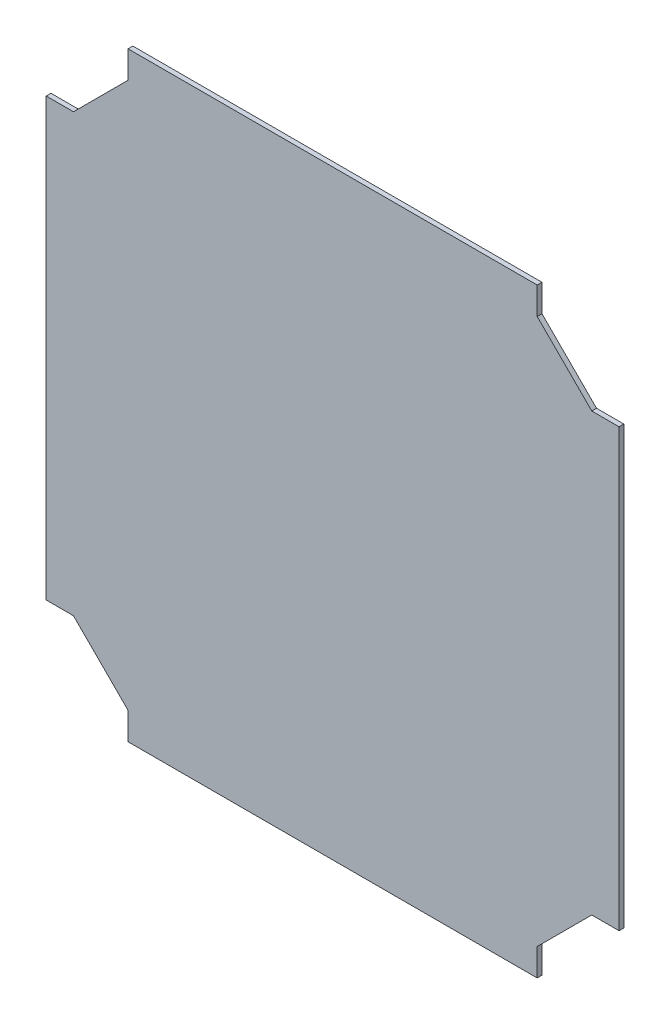
ISO-10303-21;
HEADER;
FILE_DESCRIPTION(('STEP AP214'),'2;1');
FILE_NAME('part.step','',(''),(''),'','','');
FILE_SCHEMA(('AUTOMOTIVE_DESIGN { 1 0 10303 214 1 1 1 1 }'));
ENDSEC;
DATA;
#1=APPLICATION_CONTEXT('core data for automotive mechanical design processes');
#2=APPLICATION_PROTOCOL_DEFINITION('international standard','automotive_design',2000,#1);
#3=PRODUCT_CONTEXT('',#1,'mechanical');
#4=PRODUCT('Part','Part','',(#3));
#5=PRODUCT_RELATED_PRODUCT_CATEGORY('part','',(#4));
#6=PRODUCT_DEFINITION_FORMATION('','',#4);
#7=PRODUCT_DEFINITION_CONTEXT('part definition',#1,'design');
#8=PRODUCT_DEFINITION('design','',#6,#7);
#9=PRODUCT_DEFINITION_SHAPE('','',#8);
#10=(LENGTH_UNIT() NAMED_UNIT(*) SI_UNIT(.MILLI.,.METRE.));
#11=(NAMED_UNIT(*) PLANE_ANGLE_UNIT() SI_UNIT($,.RADIAN.));
#12=(NAMED_UNIT(*) SI_UNIT($,.STERADIAN.) SOLID_ANGLE_UNIT());
#13=UNCERTAINTY_MEASURE_WITH_UNIT(LENGTH_MEASURE(1.E-05),#10,'distance_accuracy_value','');
#14=(GEOMETRIC_REPRESENTATION_CONTEXT(3) GLOBAL_UNCERTAINTY_ASSIGNED_CONTEXT((#13)) GLOBAL_UNIT_ASSIGNED_CONTEXT((#10,
#11,#12)) REPRESENTATION_CONTEXT('',''));
#15=CARTESIAN_POINT('',(0.,0.,0.));
#16=DIRECTION('',(0.,0.,1.));
#17=DIRECTION('',(1.,0.,0.));
#18=AXIS2_PLACEMENT_3D('',#15,#16,#17);
#19=CARTESIAN_POINT('',(-74.4468485132246,419.999999999776,3.5));
#20=DIRECTION('',(1.,1.5404344466475E-13,0.));
#21=DIRECTION('',(-1.5404344466475E-13,1.,0.));
#22=AXIS2_PLACEMENT_3D('',#19,#20,#21);
#23=PLANE('',#22);
#24=DIRECTION('',(1.5404344466475E-13,-1.,0.));
#25=VECTOR('',#24,1.);
#26=CARTESIAN_POINT('',(-74.4468485132246,419.999999999776,0.));
#27=LINE('',#26,#25);
#28=CARTESIAN_POINT('',(-74.4468485132277,440.000000000034,0.));
#29=VERTEX_POINT('',#28);
#30=CARTESIAN_POINT('',(-74.4468485132246,419.999999999776,0.));
#31=VERTEX_POINT('',#30);
#32=EDGE_CURVE('E183',#29,#31,#27,.T.);
#33=ORIENTED_EDGE('',*,*,#32,.T.);
#34=DIRECTION('',(0.,0.,-1.));
#35=VECTOR('',#34,1.);
#36=CARTESIAN_POINT('',(-74.4468485132246,419.999999999776,3.5));
#37=LINE('',#36,#35);
#38=CARTESIAN_POINT('',(-74.4468485132246,419.999999999776,3.5));
#39=VERTEX_POINT('',#38);
#40=EDGE_CURVE('E11',#39,#31,#37,.T.);
#41=ORIENTED_EDGE('',*,*,#40,.F.);
#42=DIRECTION('',(1.5404344466475E-13,-1.,0.));
#43=VECTOR('',#42,1.);
#44=CARTESIAN_POINT('',(-74.4468485132246,419.999999999776,3.5));
#45=LINE('',#44,#43);
#46=CARTESIAN_POINT('',(-74.4468485132277,440.000000000034,3.5));
#47=VERTEX_POINT('',#46);
#48=EDGE_CURVE('E214',#47,#39,#45,.T.);
#49=ORIENTED_EDGE('',*,*,#48,.F.);
#50=DIRECTION('',(0.,0.,-1.));
#51=VECTOR('',#50,1.);
#52=CARTESIAN_POINT('',(-74.4468485132277,440.000000000034,3.5));
#53=LINE('',#52,#51);
#54=EDGE_CURVE('E179',#47,#29,#53,.T.);
#55=ORIENTED_EDGE('',*,*,#54,.T.);
#56=EDGE_LOOP('',(#33,#41,#49,#55));
#57=FACE_BOUND('',#56,.T.);
#58=ADVANCED_FACE('F39',(#57),#23,.F.);
#59=CARTESIAN_POINT('',(-114.446848512919,380.000000000058,3.5));
#60=DIRECTION('',(0.707106781186745,-0.70710678118635,0.));
#61=DIRECTION('',(0.70710678118635,0.707106781186745,0.));
#62=AXIS2_PLACEMENT_3D('',#59,#60,#61);
#63=PLANE('',#62);
#64=DIRECTION('',(-0.70710678118635,-0.707106781186745,0.));
#65=VECTOR('',#64,1.);
#66=CARTESIAN_POINT('',(-114.446848512919,380.000000000058,0.));
#67=LINE('',#66,#65);
#68=CARTESIAN_POINT('',(-114.446848512919,380.000000000058,0.));
#69=VERTEX_POINT('',#68);
#70=EDGE_CURVE('E186',#31,#69,#67,.T.);
#71=ORIENTED_EDGE('',*,*,#70,.T.);
#72=DIRECTION('',(0.,0.,-1.));
#73=VECTOR('',#72,1.);
#74=CARTESIAN_POINT('',(-114.446848512919,380.000000000058,3.5));
#75=LINE('',#74,#73);
#76=CARTESIAN_POINT('',(-114.446848512919,380.000000000058,3.5));
#77=VERTEX_POINT('',#76);
#78=EDGE_CURVE('E47',#77,#69,#75,.T.);
#79=ORIENTED_EDGE('',*,*,#78,.F.);
#80=DIRECTION('',(-0.70710678118635,-0.707106781186745,0.));
#81=VECTOR('',#80,1.);
#82=CARTESIAN_POINT('',(-114.446848512919,380.000000000058,3.5));
#83=LINE('',#82,#81);
#84=EDGE_CURVE('E122',#39,#77,#83,.T.);
#85=ORIENTED_EDGE('',*,*,#84,.F.);
#86=ORIENTED_EDGE('',*,*,#40,.T.);
#87=EDGE_LOOP('',(#71,#79,#85,#86));
#88=FACE_BOUND('',#87,.T.);
#89=ADVANCED_FACE('F312',(#88),#63,.F.);
#90=CARTESIAN_POINT('',(-134.446848512876,380.000000000059,3.5));
#91=DIRECTION('',(0.,-1.,0.));
#92=DIRECTION('',(1.,0.,0.));
#93=AXIS2_PLACEMENT_3D('',#90,#91,#92);
#94=PLANE('',#93);
#95=DIRECTION('',(-1.,0.,0.));
#96=VECTOR('',#95,1.);
#97=CARTESIAN_POINT('',(-134.446848512876,380.000000000059,0.));
#98=LINE('',#97,#96);
#99=CARTESIAN_POINT('',(-134.446848512876,380.000000000059,0.));
#100=VERTEX_POINT('',#99);
#101=EDGE_CURVE('E188',#69,#100,#98,.T.);
#102=ORIENTED_EDGE('',*,*,#101,.T.);
#103=DIRECTION('',(0.,0.,-1.));
#104=VECTOR('',#103,1.);
#105=CARTESIAN_POINT('',(-134.446848512876,380.000000000059,3.5));
#106=LINE('',#105,#104);
#107=CARTESIAN_POINT('',(-134.446848512876,380.000000000059,3.5));
#108=VERTEX_POINT('',#107);
#109=EDGE_CURVE('E245',#108,#100,#106,.T.);
#110=ORIENTED_EDGE('',*,*,#109,.F.);
#111=DIRECTION('',(-1.,0.,0.));
#112=VECTOR('',#111,1.);
#113=CARTESIAN_POINT('',(-134.446848512876,380.000000000059,3.5));
#114=LINE('',#113,#112);
#115=EDGE_CURVE('E253',#77,#108,#114,.T.);
#116=ORIENTED_EDGE('',*,*,#115,.F.);
#117=ORIENTED_EDGE('',*,*,#78,.T.);
#118=EDGE_LOOP('',(#102,#110,#116,#117));
#119=FACE_BOUND('',#118,.T.);
#120=ADVANCED_FACE('F251',(#119),#94,.F.);
#121=CARTESIAN_POINT('',(-134.446848512876,60.0000000000639,3.5));
#122=DIRECTION('',(1.,0.,0.));
#123=DIRECTION('',(0.,1.,0.));
#124=AXIS2_PLACEMENT_3D('',#121,#122,#123);
#125=PLANE('',#124);
#126=DIRECTION('',(0.,-1.,0.));
#127=VECTOR('',#126,1.);
#128=CARTESIAN_POINT('',(-134.446848512876,60.0000000000639,0.));
#129=LINE('',#128,#127);
#130=CARTESIAN_POINT('',(-134.446848512876,60.0000000000639,0.));
#131=VERTEX_POINT('',#130);
#132=EDGE_CURVE('E190',#100,#131,#129,.T.);
#133=ORIENTED_EDGE('',*,*,#132,.T.);
#134=DIRECTION('',(0.,0.,-1.));
#135=VECTOR('',#134,1.);
#136=CARTESIAN_POINT('',(-134.446848512876,60.0000000000639,3.5));
#137=LINE('',#136,#135);
#138=CARTESIAN_POINT('',(-134.446848512876,60.0000000000639,3.5));
#139=VERTEX_POINT('',#138);
#140=EDGE_CURVE('E242',#139,#131,#137,.T.);
#141=ORIENTED_EDGE('',*,*,#140,.F.);
#142=DIRECTION('',(0.,-1.,0.));
#143=VECTOR('',#142,1.);
#144=CARTESIAN_POINT('',(-134.446848512876,60.0000000000639,3.5));
#145=LINE('',#144,#143);
#146=EDGE_CURVE('E271',#108,#139,#145,.T.);
#147=ORIENTED_EDGE('',*,*,#146,.F.);
#148=ORIENTED_EDGE('',*,*,#109,.T.);
#149=EDGE_LOOP('',(#133,#141,#147,#148));
#150=FACE_BOUND('',#149,.T.);
#151=ADVANCED_FACE('F262',(#150),#125,.F.);
#152=CARTESIAN_POINT('',(-114.446848512873,60.0000000000639,3.5));
#153=DIRECTION('',(0.,1.,0.));
#154=DIRECTION('',(0.,0.,1.));
#155=AXIS2_PLACEMENT_3D('',#152,#153,#154);
#156=PLANE('',#155);
#157=DIRECTION('',(1.,0.,0.));
#158=VECTOR('',#157,1.);
#159=CARTESIAN_POINT('',(-114.446848512873,60.0000000000639,0.));
#160=LINE('',#159,#158);
#161=CARTESIAN_POINT('',(-114.446848512873,60.0000000000639,0.));
#162=VERTEX_POINT('',#161);
#163=EDGE_CURVE('E192',#131,#162,#160,.T.);
#164=ORIENTED_EDGE('',*,*,#163,.T.);
#165=DIRECTION('',(0.,0.,-1.));
#166=VECTOR('',#165,1.);
#167=CARTESIAN_POINT('',(-114.446848512873,60.0000000000639,3.5));
#168=LINE('',#167,#166);
#169=CARTESIAN_POINT('',(-114.446848512873,60.0000000000639,3.5));
#170=VERTEX_POINT('',#169);
#171=EDGE_CURVE('E239',#170,#162,#168,.T.);
#172=ORIENTED_EDGE('',*,*,#171,.F.);
#173=DIRECTION('',(1.,0.,0.));
#174=VECTOR('',#173,1.);
#175=CARTESIAN_POINT('',(-114.446848512873,60.0000000000639,3.5));
#176=LINE('',#175,#174);
#177=EDGE_CURVE('E268',#139,#170,#176,.T.);
#178=ORIENTED_EDGE('',*,*,#177,.F.);
#179=ORIENTED_EDGE('',*,*,#140,.T.);
#180=EDGE_LOOP('',(#164,#172,#178,#179));
#181=FACE_BOUND('',#180,.T.);
#182=ADVANCED_FACE('F266',(#181),#156,.F.);
#183=CARTESIAN_POINT('',(-74.4468485128761,20.0000000000889,3.5));
#184=DIRECTION('',(0.70710678118635,0.707106781186745,0.));
#185=DIRECTION('',(-0.707106781186745,0.70710678118635,0.));
#186=AXIS2_PLACEMENT_3D('',#183,#184,#185);
#187=PLANE('',#186);
#188=DIRECTION('',(0.707106781186745,-0.70710678118635,0.));
#189=VECTOR('',#188,1.);
#190=CARTESIAN_POINT('',(-74.4468485128761,20.0000000000889,0.));
#191=LINE('',#190,#189);
#192=CARTESIAN_POINT('',(-74.4468485128761,20.0000000000889,0.));
#193=VERTEX_POINT('',#192);
#194=EDGE_CURVE('E194',#162,#193,#191,.T.);
#195=ORIENTED_EDGE('',*,*,#194,.T.);
#196=DIRECTION('',(0.,0.,-1.));
#197=VECTOR('',#196,1.);
#198=CARTESIAN_POINT('',(-74.4468485128761,20.0000000000889,3.5));
#199=LINE('',#198,#197);
#200=CARTESIAN_POINT('',(-74.4468485128761,20.0000000000889,3.5));
#201=VERTEX_POINT('',#200);
#202=EDGE_CURVE('E236',#201,#193,#199,.T.);
#203=ORIENTED_EDGE('',*,*,#202,.F.);
#204=DIRECTION('',(0.707106781186745,-0.70710678118635,0.));
#205=VECTOR('',#204,1.);
#206=CARTESIAN_POINT('',(-74.4468485128761,20.0000000000889,3.5));
#207=LINE('',#206,#205);
#208=EDGE_CURVE('E270',#170,#201,#207,.T.);
#209=ORIENTED_EDGE('',*,*,#208,.F.);
#210=ORIENTED_EDGE('',*,*,#171,.T.);
#211=EDGE_LOOP('',(#195,#203,#209,#210));
#212=FACE_BOUND('',#211,.T.);
#213=ADVANCED_FACE('F325',(#212),#187,.F.);
#214=CARTESIAN_POINT('',(-74.4468485128761,-4.73422112382014E-12,3.5));
#215=DIRECTION('',(1.,0.,0.));
#216=DIRECTION('',(0.,0.,-1.));
#217=AXIS2_PLACEMENT_3D('',#214,#215,#216);
#218=PLANE('',#217);
#219=DIRECTION('',(0.,-1.,0.));
#220=VECTOR('',#219,1.);
#221=CARTESIAN_POINT('',(-74.4468485128761,-4.73422112382014E-12,0.));
#222=LINE('',#221,#220);
#223=CARTESIAN_POINT('',(-74.4468485128761,-4.73422112382014E-12,0.));
#224=VERTEX_POINT('',#223);
#225=EDGE_CURVE('E196',#193,#224,#222,.T.);
#226=ORIENTED_EDGE('',*,*,#225,.T.);
#227=DIRECTION('',(0.,0.,-1.));
#228=VECTOR('',#227,1.);
#229=CARTESIAN_POINT('',(-74.4468485128761,-4.73422112382014E-12,3.5));
#230=LINE('',#229,#228);
#231=CARTESIAN_POINT('',(-74.4468485128761,-4.73422112382014E-12,3.5));
#232=VERTEX_POINT('',#231);
#233=EDGE_CURVE('E233',#232,#224,#230,.T.);
#234=ORIENTED_EDGE('',*,*,#233,.F.);
#235=DIRECTION('',(0.,-1.,0.));
#236=VECTOR('',#235,1.);
#237=CARTESIAN_POINT('',(-74.4468485128761,-4.73422112382014E-12,3.5));
#238=LINE('',#237,#236);
#239=EDGE_CURVE('E273',#201,#232,#238,.T.);
#240=ORIENTED_EDGE('',*,*,#239,.F.);
#241=ORIENTED_EDGE('',*,*,#202,.T.);
#242=EDGE_LOOP('',(#226,#234,#240,#241));
#243=FACE_BOUND('',#242,.T.);
#244=ADVANCED_FACE('F328',(#243),#218,.F.);
#245=CARTESIAN_POINT('',(0.,0.,3.5));
#246=DIRECTION('',(0.,1.,0.));
#247=DIRECTION('',(-1.,0.,0.));
#248=AXIS2_PLACEMENT_3D('',#245,#246,#247);
#249=PLANE('',#248);
#250=DIRECTION('',(1.,0.,0.));
#251=VECTOR('',#250,1.);
#252=CARTESIAN_POINT('',(0.,0.,0.));
#253=LINE('',#252,#251);
#254=CARTESIAN_POINT('',(225.553151487123,-4.69748171984573E-12,0.));
#255=VERTEX_POINT('',#254);
#256=EDGE_CURVE('E199',#224,#255,#253,.T.);
#257=ORIENTED_EDGE('',*,*,#256,.T.);
#258=DIRECTION('',(0.,0.,-1.));
#259=VECTOR('',#258,1.);
#260=CARTESIAN_POINT('',(225.553151487123,-4.69748171984573E-12,3.5));
#261=LINE('',#260,#259);
#262=CARTESIAN_POINT('',(225.553151487123,-4.69748171984573E-12,3.5));
#263=VERTEX_POINT('',#262);
#264=EDGE_CURVE('E230',#263,#255,#261,.T.);
#265=ORIENTED_EDGE('',*,*,#264,.F.);
#266=DIRECTION('',(1.,0.,0.));
#267=VECTOR('',#266,1.);
#268=CARTESIAN_POINT('',(-74.4468485128761,-4.73422112382014E-12,3.5));
#269=LINE('',#268,#267);
#270=EDGE_CURVE('E279',#232,#263,#269,.T.);
#271=ORIENTED_EDGE('',*,*,#270,.F.);
#272=ORIENTED_EDGE('',*,*,#233,.T.);
#273=EDGE_LOOP('',(#257,#265,#271,#272));
#274=FACE_BOUND('',#273,.T.);
#275=ADVANCED_FACE('F332',(#274),#249,.F.);
#276=CARTESIAN_POINT('',(225.553151487123,20.000000000064,3.5));
#277=DIRECTION('',(-1.,0.,0.));
#278=DIRECTION('',(0.,0.,1.));
#279=AXIS2_PLACEMENT_3D('',#276,#277,#278);
#280=PLANE('',#279);
#281=DIRECTION('',(0.,1.,0.));
#282=VECTOR('',#281,1.);
#283=CARTESIAN_POINT('',(225.553151487123,20.000000000064,0.));
#284=LINE('',#283,#282);
#285=CARTESIAN_POINT('',(225.553151487123,20.000000000064,0.));
#286=VERTEX_POINT('',#285);
#287=EDGE_CURVE('E201',#255,#286,#284,.T.);
#288=ORIENTED_EDGE('',*,*,#287,.T.);
#289=DIRECTION('',(0.,0.,-1.));
#290=VECTOR('',#289,1.);
#291=CARTESIAN_POINT('',(225.553151487123,20.000000000064,3.5));
#292=LINE('',#291,#290);
#293=CARTESIAN_POINT('',(225.553151487123,20.000000000064,3.5));
#294=VERTEX_POINT('',#293);
#295=EDGE_CURVE('E227',#294,#286,#292,.T.);
#296=ORIENTED_EDGE('',*,*,#295,.F.);
#297=DIRECTION('',(0.,1.,0.));
#298=VECTOR('',#297,1.);
#299=CARTESIAN_POINT('',(225.553151487123,20.000000000064,3.5));
#300=LINE('',#299,#298);
#301=EDGE_CURVE('E281',#263,#294,#300,.T.);
#302=ORIENTED_EDGE('',*,*,#301,.F.);
#303=ORIENTED_EDGE('',*,*,#264,.T.);
#304=EDGE_LOOP('',(#288,#296,#302,#303));
#305=FACE_BOUND('',#304,.T.);
#306=ADVANCED_FACE('F336',(#305),#280,.F.);
#307=CARTESIAN_POINT('',(265.553151487073,60.0000000000393,3.5));
#308=DIRECTION('',(-0.707106781186773,0.707106781186322,0.));
#309=DIRECTION('',(-0.707106781186322,-0.707106781186773,0.));
#310=AXIS2_PLACEMENT_3D('',#307,#308,#309);
#311=PLANE('',#310);
#312=DIRECTION('',(0.707106781186322,0.707106781186773,0.));
#313=VECTOR('',#312,1.);
#314=CARTESIAN_POINT('',(265.553151487073,60.0000000000393,0.));
#315=LINE('',#314,#313);
#316=CARTESIAN_POINT('',(265.553151487073,60.0000000000393,0.));
#317=VERTEX_POINT('',#316);
#318=EDGE_CURVE('E203',#286,#317,#315,.T.);
#319=ORIENTED_EDGE('',*,*,#318,.T.);
#320=DIRECTION('',(0.,0.,-1.));
#321=VECTOR('',#320,1.);
#322=CARTESIAN_POINT('',(265.553151487073,60.0000000000393,3.5));
#323=LINE('',#322,#321);
#324=CARTESIAN_POINT('',(265.553151487073,60.0000000000393,3.5));
#325=VERTEX_POINT('',#324);
#326=EDGE_CURVE('E224',#325,#317,#323,.T.);
#327=ORIENTED_EDGE('',*,*,#326,.F.);
#328=DIRECTION('',(0.707106781186322,0.707106781186773,0.));
#329=VECTOR('',#328,1.);
#330=CARTESIAN_POINT('',(265.553151487073,60.0000000000393,3.5));
#331=LINE('',#330,#329);
#332=EDGE_CURVE('E283',#294,#325,#331,.T.);
#333=ORIENTED_EDGE('',*,*,#332,.F.);
#334=ORIENTED_EDGE('',*,*,#295,.T.);
#335=EDGE_LOOP('',(#319,#327,#333,#334));
#336=FACE_BOUND('',#335,.T.);
#337=ADVANCED_FACE('F340',(#336),#311,.F.);
#338=CARTESIAN_POINT('',(285.553151487212,60.000000000039,3.5));
#339=DIRECTION('',(0.,1.,0.));
#340=DIRECTION('',(-1.,0.,0.));
#341=AXIS2_PLACEMENT_3D('',#338,#339,#340);
#342=PLANE('',#341);
#343=DIRECTION('',(1.,0.,0.));
#344=VECTOR('',#343,1.);
#345=CARTESIAN_POINT('',(285.553151487212,60.000000000039,0.));
#346=LINE('',#345,#344);
#347=CARTESIAN_POINT('',(285.553151487212,60.000000000039,0.));
#348=VERTEX_POINT('',#347);
#349=EDGE_CURVE('E205',#317,#348,#346,.T.);
#350=ORIENTED_EDGE('',*,*,#349,.T.);
#351=DIRECTION('',(0.,0.,-1.));
#352=VECTOR('',#351,1.);
#353=CARTESIAN_POINT('',(285.553151487212,60.000000000039,3.5));
#354=LINE('',#353,#352);
#355=CARTESIAN_POINT('',(285.553151487212,60.000000000039,3.5));
#356=VERTEX_POINT('',#355);
#357=EDGE_CURVE('E221',#356,#348,#354,.T.);
#358=ORIENTED_EDGE('',*,*,#357,.F.);
#359=DIRECTION('',(1.,0.,0.));
#360=VECTOR('',#359,1.);
#361=CARTESIAN_POINT('',(285.553151487212,60.000000000039,3.5));
#362=LINE('',#361,#360);
#363=EDGE_CURVE('E285',#325,#356,#362,.T.);
#364=ORIENTED_EDGE('',*,*,#363,.F.);
#365=ORIENTED_EDGE('',*,*,#326,.T.);
#366=EDGE_LOOP('',(#350,#358,#364,#365));
#367=FACE_BOUND('',#366,.T.);
#368=ADVANCED_FACE('F344',(#367),#342,.F.);
#369=CARTESIAN_POINT('',(285.553151487212,380.000000000038,3.5));
#370=DIRECTION('',(-1.,0.,0.));
#371=DIRECTION('',(0.,-1.,0.));
#372=AXIS2_PLACEMENT_3D('',#369,#370,#371);
#373=PLANE('',#372);
#374=DIRECTION('',(0.,1.,0.));
#375=VECTOR('',#374,1.);
#376=CARTESIAN_POINT('',(285.553151487212,380.000000000038,0.));
#377=LINE('',#376,#375);
#378=CARTESIAN_POINT('',(285.553151487212,380.000000000038,0.));
#379=VERTEX_POINT('',#378);
#380=EDGE_CURVE('E207',#348,#379,#377,.T.);
#381=ORIENTED_EDGE('',*,*,#380,.T.);
#382=DIRECTION('',(0.,0.,-1.));
#383=VECTOR('',#382,1.);
#384=CARTESIAN_POINT('',(285.553151487212,380.000000000038,3.5));
#385=LINE('',#384,#383);
#386=CARTESIAN_POINT('',(285.553151487212,380.000000000038,3.5));
#387=VERTEX_POINT('',#386);
#388=EDGE_CURVE('E218',#387,#379,#385,.T.);
#389=ORIENTED_EDGE('',*,*,#388,.F.);
#390=DIRECTION('',(0.,1.,0.));
#391=VECTOR('',#390,1.);
#392=CARTESIAN_POINT('',(285.553151487212,380.000000000038,3.5));
#393=LINE('',#392,#391);
#394=EDGE_CURVE('E287',#356,#387,#393,.T.);
#395=ORIENTED_EDGE('',*,*,#394,.F.);
#396=ORIENTED_EDGE('',*,*,#357,.T.);
#397=EDGE_LOOP('',(#381,#389,#395,#396));
#398=FACE_BOUND('',#397,.T.);
#399=ADVANCED_FACE('F293',(#398),#373,.F.);
#400=CARTESIAN_POINT('',(265.55315148725,380.000000000039,3.5));
#401=DIRECTION('',(0.,-1.,0.));
#402=DIRECTION('',(1.,0.,0.));
#403=AXIS2_PLACEMENT_3D('',#400,#401,#402);
#404=PLANE('',#403);
#405=DIRECTION('',(-1.,0.,0.));
#406=VECTOR('',#405,1.);
#407=CARTESIAN_POINT('',(265.55315148725,380.000000000039,0.));
#408=LINE('',#407,#406);
#409=CARTESIAN_POINT('',(265.55315148725,380.000000000039,0.));
#410=VERTEX_POINT('',#409);
#411=EDGE_CURVE('E209',#379,#410,#408,.T.);
#412=ORIENTED_EDGE('',*,*,#411,.T.);
#413=DIRECTION('',(0.,0.,-1.));
#414=VECTOR('',#413,1.);
#415=CARTESIAN_POINT('',(265.55315148725,380.000000000039,3.5));
#416=LINE('',#415,#414);
#417=CARTESIAN_POINT('',(265.55315148725,380.000000000039,3.5));
#418=VERTEX_POINT('',#417);
#419=EDGE_CURVE('E174',#418,#410,#416,.T.);
#420=ORIENTED_EDGE('',*,*,#419,.F.);
#421=DIRECTION('',(-1.,0.,0.));
#422=VECTOR('',#421,1.);
#423=CARTESIAN_POINT('',(265.55315148725,380.000000000039,3.5));
#424=LINE('',#423,#422);
#425=EDGE_CURVE('E165',#387,#418,#424,.T.);
#426=ORIENTED_EDGE('',*,*,#425,.F.);
#427=ORIENTED_EDGE('',*,*,#388,.T.);
#428=EDGE_LOOP('',(#412,#420,#426,#427));
#429=FACE_BOUND('',#428,.T.);
#430=ADVANCED_FACE('F297',(#429),#404,.F.);
#431=CARTESIAN_POINT('',(225.553151486093,420.000000001174,3.5));
#432=DIRECTION('',(-0.707106781186349,-0.707106781186746,0.));
#433=DIRECTION('',(0.707106781186746,-0.707106781186349,0.));
#434=AXIS2_PLACEMENT_3D('',#431,#432,#433);
#435=PLANE('',#434);
#436=DIRECTION('',(-0.707106781186746,0.707106781186349,0.));
#437=VECTOR('',#436,1.);
#438=CARTESIAN_POINT('',(225.553151486093,420.000000001174,0.));
#439=LINE('',#438,#437);
#440=CARTESIAN_POINT('',(225.553151486093,420.000000001174,0.));
#441=VERTEX_POINT('',#440);
#442=EDGE_CURVE('E173',#410,#441,#439,.T.);
#443=ORIENTED_EDGE('',*,*,#442,.T.);
#444=DIRECTION('',(0.,0.,-1.));
#445=VECTOR('',#444,1.);
#446=CARTESIAN_POINT('',(225.553151486093,420.000000001174,3.5));
#447=LINE('',#446,#445);
#448=CARTESIAN_POINT('',(225.553151486093,420.000000001174,3.5));
#449=VERTEX_POINT('',#448);
#450=EDGE_CURVE('E170',#449,#441,#447,.T.);
#451=ORIENTED_EDGE('',*,*,#450,.F.);
#452=DIRECTION('',(-0.707106781186746,0.707106781186349,0.));
#453=VECTOR('',#452,1.);
#454=CARTESIAN_POINT('',(225.553151486093,420.000000001174,3.5));
#455=LINE('',#454,#453);
#456=EDGE_CURVE('E159',#418,#449,#455,.T.);
#457=ORIENTED_EDGE('',*,*,#456,.F.);
#458=ORIENTED_EDGE('',*,*,#419,.T.);
#459=EDGE_LOOP('',(#443,#451,#457,#458));
#460=FACE_BOUND('',#459,.T.);
#461=ADVANCED_FACE('F171',(#460),#435,.F.);
#462=CARTESIAN_POINT('',(225.553151486093,440.000000000034,3.5));
#463=DIRECTION('',(-1.,0.,0.));
#464=DIRECTION('',(0.,-1.,0.));
#465=AXIS2_PLACEMENT_3D('',#462,#463,#464);
#466=PLANE('',#465);
#467=DIRECTION('',(0.,1.,0.));
#468=VECTOR('',#467,1.);
#469=CARTESIAN_POINT('',(225.553151486093,440.000000000034,0.));
#470=LINE('',#469,#468);
#471=CARTESIAN_POINT('',(225.553151486093,440.000000000034,0.));
#472=VERTEX_POINT('',#471);
#473=EDGE_CURVE('E108',#441,#472,#470,.T.);
#474=ORIENTED_EDGE('',*,*,#473,.T.);
#475=DIRECTION('',(0.,0.,-1.));
#476=VECTOR('',#475,1.);
#477=CARTESIAN_POINT('',(225.553151486093,440.000000000034,3.5));
#478=LINE('',#477,#476);
#479=CARTESIAN_POINT('',(225.553151486093,440.000000000034,3.5));
#480=VERTEX_POINT('',#479);
#481=EDGE_CURVE('E175',#480,#472,#478,.T.);
#482=ORIENTED_EDGE('',*,*,#481,.F.);
#483=DIRECTION('',(0.,1.,0.));
#484=VECTOR('',#483,1.);
#485=CARTESIAN_POINT('',(225.553151486093,440.000000000034,3.5));
#486=LINE('',#485,#484);
#487=EDGE_CURVE('E163',#449,#480,#486,.T.);
#488=ORIENTED_EDGE('',*,*,#487,.F.);
#489=ORIENTED_EDGE('',*,*,#450,.T.);
#490=EDGE_LOOP('',(#474,#482,#488,#489));
#491=FACE_BOUND('',#490,.T.);
#492=ADVANCED_FACE('F177',(#491),#466,.F.);
#493=CARTESIAN_POINT('',(-74.4468485132277,440.000000000034,3.5));
#494=DIRECTION('',(0.,-1.,0.));
#495=DIRECTION('',(0.,0.,-1.));
#496=AXIS2_PLACEMENT_3D('',#493,#494,#495);
#497=PLANE('',#496);
#498=DIRECTION('',(-1.,0.,0.));
#499=VECTOR('',#498,1.);
#500=CARTESIAN_POINT('',(-74.4468485132277,440.000000000034,0.));
#501=LINE('',#500,#499);
#502=EDGE_CURVE('E114',#472,#29,#501,.T.);
#503=ORIENTED_EDGE('',*,*,#502,.T.);
#504=ORIENTED_EDGE('',*,*,#54,.F.);
#505=DIRECTION('',(-1.,0.,0.));
#506=VECTOR('',#505,1.);
#507=CARTESIAN_POINT('',(-74.4468485132277,440.000000000034,3.5));
#508=LINE('',#507,#506);
#509=EDGE_CURVE('E55',#480,#47,#508,.T.);
#510=ORIENTED_EDGE('',*,*,#509,.F.);
#511=ORIENTED_EDGE('',*,*,#481,.T.);
#512=EDGE_LOOP('',(#503,#504,#510,#511));
#513=FACE_BOUND('',#512,.T.);
#514=ADVANCED_FACE('F301',(#513),#497,.F.);
#515=CARTESIAN_POINT('',(0.,0.,3.5));
#516=DIRECTION('',(0.,0.,-1.));
#517=DIRECTION('',(-1.,0.,0.));
#518=AXIS2_PLACEMENT_3D('',#515,#516,#517);
#519=PLANE('',#518);
#520=ORIENTED_EDGE('',*,*,#48,.T.);
#521=ORIENTED_EDGE('',*,*,#84,.T.);
#522=ORIENTED_EDGE('',*,*,#115,.T.);
#523=ORIENTED_EDGE('',*,*,#146,.T.);
#524=ORIENTED_EDGE('',*,*,#177,.T.);
#525=ORIENTED_EDGE('',*,*,#208,.T.);
#526=ORIENTED_EDGE('',*,*,#239,.T.);
#527=ORIENTED_EDGE('',*,*,#270,.T.);
#528=ORIENTED_EDGE('',*,*,#301,.T.);
#529=ORIENTED_EDGE('',*,*,#332,.T.);
#530=ORIENTED_EDGE('',*,*,#363,.T.);
#531=ORIENTED_EDGE('',*,*,#394,.T.);
#532=ORIENTED_EDGE('',*,*,#425,.T.);
#533=ORIENTED_EDGE('',*,*,#456,.T.);
#534=ORIENTED_EDGE('',*,*,#487,.T.);
#535=ORIENTED_EDGE('',*,*,#509,.T.);
#536=EDGE_LOOP('',(#520,#521,#522,#523,#524,#525,#526,#527,#528,#529,#530,#531,#532,#533,#534,#535));
#537=FACE_BOUND('',#536,.T.);
#538=ADVANCED_FACE('F161',(#537),#519,.F.);
#539=CARTESIAN_POINT('',(0.,0.,0.));
#540=DIRECTION('',(0.,0.,-1.));
#541=DIRECTION('',(-1.,0.,0.));
#542=AXIS2_PLACEMENT_3D('',#539,#540,#541);
#543=PLANE('',#542);
#544=ORIENTED_EDGE('',*,*,#32,.F.);
#545=ORIENTED_EDGE('',*,*,#502,.F.);
#546=ORIENTED_EDGE('',*,*,#473,.F.);
#547=ORIENTED_EDGE('',*,*,#442,.F.);
#548=ORIENTED_EDGE('',*,*,#411,.F.);
#549=ORIENTED_EDGE('',*,*,#380,.F.);
#550=ORIENTED_EDGE('',*,*,#349,.F.);
#551=ORIENTED_EDGE('',*,*,#318,.F.);
#552=ORIENTED_EDGE('',*,*,#287,.F.);
#553=ORIENTED_EDGE('',*,*,#256,.F.);
#554=ORIENTED_EDGE('',*,*,#225,.F.);
#555=ORIENTED_EDGE('',*,*,#194,.F.);
#556=ORIENTED_EDGE('',*,*,#163,.F.);
#557=ORIENTED_EDGE('',*,*,#132,.F.);
#558=ORIENTED_EDGE('',*,*,#101,.F.);
#559=ORIENTED_EDGE('',*,*,#70,.F.);
#560=EDGE_LOOP('',(#544,#545,#546,#547,#548,#549,#550,#551,#552,#553,#554,#555,#556,#557,#558,#559));
#561=FACE_BOUND('',#560,.T.);
#562=ADVANCED_FACE('F257',(#561),#543,.T.);
#563=CLOSED_SHELL('',(#58,#89,#120,#151,#182,#213,#244,#275,#306,#337,#368,#399,#430,#461,#492,
#514,#538,#562));
#564=MANIFOLD_SOLID_BREP('B2',#563);
#565=ADVANCED_BREP_SHAPE_REPRESENTATION('',(#18,#564),#14);
#566=SHAPE_DEFINITION_REPRESENTATION(#9,#565);
ENDSEC;
END-ISO-10303-21;
